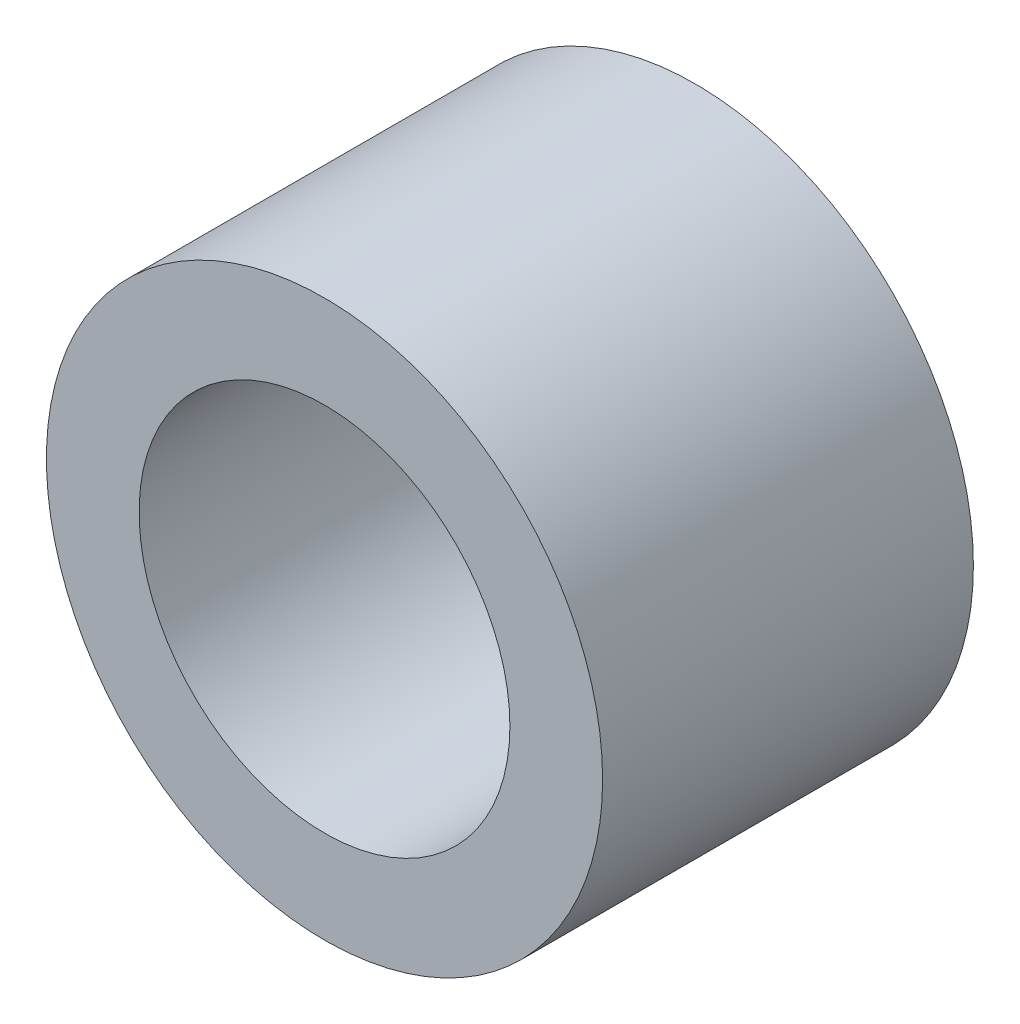
ISO-10303-21;
HEADER;
FILE_DESCRIPTION(('STEP AP214'),'2;1');
FILE_NAME('part.step','',(''),(''),'','','');
FILE_SCHEMA(('AUTOMOTIVE_DESIGN { 1 0 10303 214 1 1 1 1 }'));
ENDSEC;
DATA;
#1=APPLICATION_CONTEXT('core data for automotive mechanical design processes');
#2=APPLICATION_PROTOCOL_DEFINITION('international standard','automotive_design',2000,#1);
#3=PRODUCT_CONTEXT('',#1,'mechanical');
#4=PRODUCT('Part','Part','',(#3));
#5=PRODUCT_RELATED_PRODUCT_CATEGORY('part','',(#4));
#6=PRODUCT_DEFINITION_FORMATION('','',#4);
#7=PRODUCT_DEFINITION_CONTEXT('part definition',#1,'design');
#8=PRODUCT_DEFINITION('design','',#6,#7);
#9=PRODUCT_DEFINITION_SHAPE('','',#8);
#10=(LENGTH_UNIT() NAMED_UNIT(*) SI_UNIT(.MILLI.,.METRE.));
#11=(NAMED_UNIT(*) PLANE_ANGLE_UNIT() SI_UNIT($,.RADIAN.));
#12=(NAMED_UNIT(*) SI_UNIT($,.STERADIAN.) SOLID_ANGLE_UNIT());
#13=UNCERTAINTY_MEASURE_WITH_UNIT(LENGTH_MEASURE(1.E-05),#10,'distance_accuracy_value','');
#14=(GEOMETRIC_REPRESENTATION_CONTEXT(3) GLOBAL_UNCERTAINTY_ASSIGNED_CONTEXT((#13)) GLOBAL_UNIT_ASSIGNED_CONTEXT((#10,
#11,#12)) REPRESENTATION_CONTEXT('',''));
#15=CARTESIAN_POINT('',(0.,0.,0.));
#16=DIRECTION('',(0.,0.,1.));
#17=DIRECTION('',(1.,0.,0.));
#18=AXIS2_PLACEMENT_3D('',#15,#16,#17);
#19=CARTESIAN_POINT('',(0.,0.,10.));
#20=DIRECTION('',(0.,0.,1.));
#21=DIRECTION('',(1.,0.,0.));
#22=AXIS2_PLACEMENT_3D('',#19,#20,#21);
#23=PLANE('',#22);
#24=CARTESIAN_POINT('',(0.,0.,10.));
#25=DIRECTION('',(0.,0.,1.));
#26=DIRECTION('',(1.,0.,0.));
#27=AXIS2_PLACEMENT_3D('',#24,#25,#26);
#28=CIRCLE('',#27,7.5);
#29=CARTESIAN_POINT('',(7.5,0.,10.));
#30=VERTEX_POINT('',#29);
#31=EDGE_CURVE('E10',#30,#30,#28,.T.);
#32=ORIENTED_EDGE('',*,*,#31,.T.);
#33=EDGE_LOOP('',(#32));
#34=FACE_BOUND('',#33,.T.);
#35=CARTESIAN_POINT('',(0.,0.,10.));
#36=DIRECTION('',(0.,0.,1.));
#37=DIRECTION('',(1.,0.,0.));
#38=AXIS2_PLACEMENT_3D('',#35,#36,#37);
#39=CIRCLE('',#38,5.);
#40=CARTESIAN_POINT('',(5.,0.,10.));
#41=VERTEX_POINT('',#40);
#42=EDGE_CURVE('E50',#41,#41,#39,.T.);
#43=ORIENTED_EDGE('',*,*,#42,.F.);
#44=EDGE_LOOP('',(#43));
#45=FACE_BOUND('',#44,.T.);
#46=ADVANCED_FACE('F37',(#34,#45),#23,.T.);
#47=CARTESIAN_POINT('',(0.,0.,0.));
#48=DIRECTION('',(0.,0.,1.));
#49=DIRECTION('',(1.,0.,0.));
#50=AXIS2_PLACEMENT_3D('',#47,#48,#49);
#51=PLANE('',#50);
#52=CARTESIAN_POINT('',(0.,0.,0.));
#53=DIRECTION('',(0.,0.,1.));
#54=DIRECTION('',(1.,0.,0.));
#55=AXIS2_PLACEMENT_3D('',#52,#53,#54);
#56=CIRCLE('',#55,7.5);
#57=CARTESIAN_POINT('',(7.5,0.,0.));
#58=VERTEX_POINT('',#57);
#59=EDGE_CURVE('E41',#58,#58,#56,.T.);
#60=ORIENTED_EDGE('',*,*,#59,.F.);
#61=EDGE_LOOP('',(#60));
#62=FACE_BOUND('',#61,.T.);
#63=CARTESIAN_POINT('',(0.,0.,0.));
#64=DIRECTION('',(0.,0.,1.));
#65=DIRECTION('',(1.,0.,0.));
#66=AXIS2_PLACEMENT_3D('',#63,#64,#65);
#67=CIRCLE('',#66,5.);
#68=CARTESIAN_POINT('',(5.,0.,0.));
#69=VERTEX_POINT('',#68);
#70=EDGE_CURVE('E52',#69,#69,#67,.T.);
#71=ORIENTED_EDGE('',*,*,#70,.T.);
#72=EDGE_LOOP('',(#71));
#73=FACE_BOUND('',#72,.T.);
#74=ADVANCED_FACE('F64',(#62,#73),#51,.F.);
#75=CARTESIAN_POINT('',(0.,0.,10.));
#76=DIRECTION('',(0.,0.,-1.));
#77=DIRECTION('',(-1.,0.,0.));
#78=AXIS2_PLACEMENT_3D('',#75,#76,#77);
#79=CYLINDRICAL_SURFACE('',#78,7.5);
#80=ORIENTED_EDGE('',*,*,#31,.F.);
#81=EDGE_LOOP('',(#80));
#82=FACE_BOUND('',#81,.T.);
#83=ORIENTED_EDGE('',*,*,#59,.T.);
#84=EDGE_LOOP('',(#83));
#85=FACE_BOUND('',#84,.T.);
#86=ADVANCED_FACE('F39',(#82,#85),#79,.T.);
#87=CARTESIAN_POINT('',(0.,0.,10.));
#88=DIRECTION('',(0.,0.,-1.));
#89=DIRECTION('',(-1.,0.,0.));
#90=AXIS2_PLACEMENT_3D('',#87,#88,#89);
#91=CYLINDRICAL_SURFACE('',#90,5.);
#92=ORIENTED_EDGE('',*,*,#42,.T.);
#93=EDGE_LOOP('',(#92));
#94=FACE_BOUND('',#93,.T.);
#95=ORIENTED_EDGE('',*,*,#70,.F.);
#96=EDGE_LOOP('',(#95));
#97=FACE_BOUND('',#96,.T.);
#98=ADVANCED_FACE('F60',(#94,#97),#91,.F.);
#99=CLOSED_SHELL('',(#46,#74,#86,#98));
#100=MANIFOLD_SOLID_BREP('B2',#99);
#101=ADVANCED_BREP_SHAPE_REPRESENTATION('',(#18,#100),#14);
#102=SHAPE_DEFINITION_REPRESENTATION(#9,#101);
ENDSEC;
END-ISO-10303-21;
